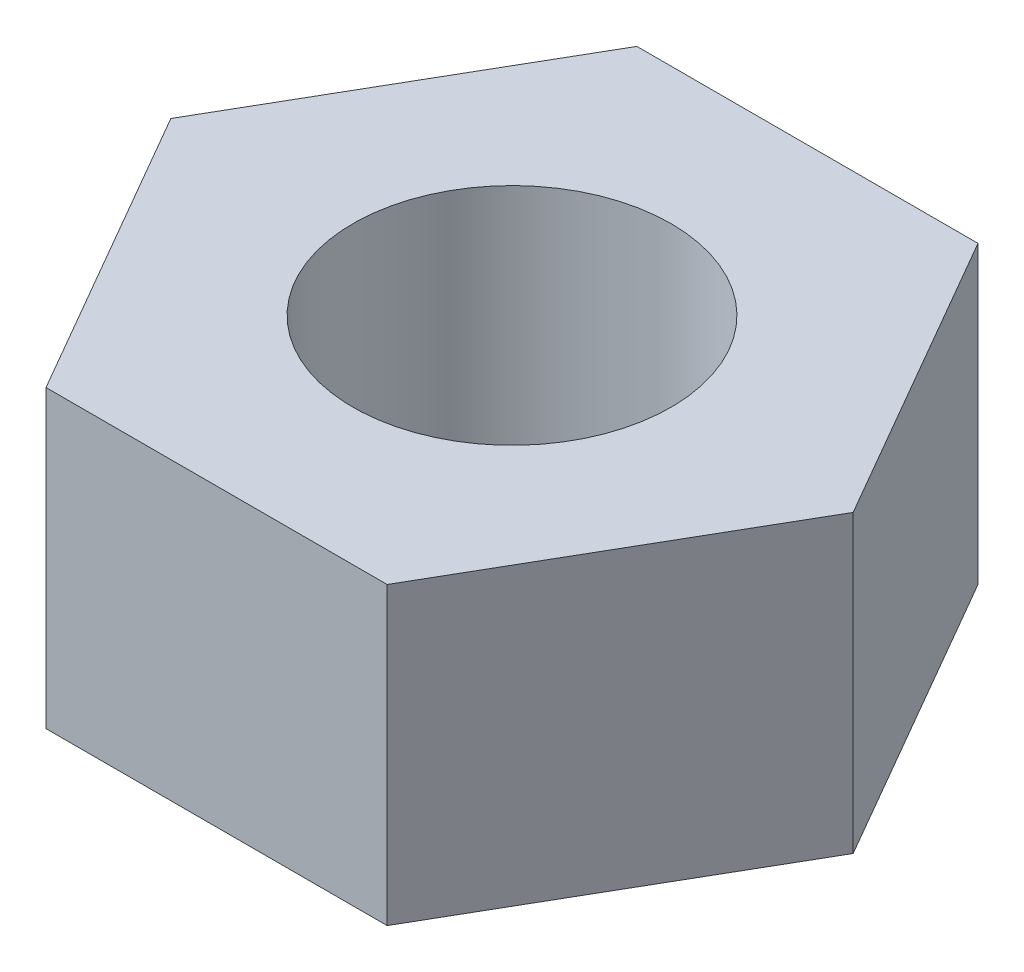
ISO-10303-21;
HEADER;
FILE_DESCRIPTION(('STEP AP214'),'2;1');
FILE_NAME('part.step','',(''),(''),'','','');
FILE_SCHEMA(('AUTOMOTIVE_DESIGN { 1 0 10303 214 1 1 1 1 }'));
ENDSEC;
DATA;
#1=APPLICATION_CONTEXT('core data for automotive mechanical design processes');
#2=APPLICATION_PROTOCOL_DEFINITION('international standard','automotive_design',2000,#1);
#3=PRODUCT_CONTEXT('',#1,'mechanical');
#4=PRODUCT('Part','Part','',(#3));
#5=PRODUCT_RELATED_PRODUCT_CATEGORY('part','',(#4));
#6=PRODUCT_DEFINITION_FORMATION('','',#4);
#7=PRODUCT_DEFINITION_CONTEXT('part definition',#1,'design');
#8=PRODUCT_DEFINITION('design','',#6,#7);
#9=PRODUCT_DEFINITION_SHAPE('','',#8);
#10=(LENGTH_UNIT() NAMED_UNIT(*) SI_UNIT(.MILLI.,.METRE.));
#11=(NAMED_UNIT(*) PLANE_ANGLE_UNIT() SI_UNIT($,.RADIAN.));
#12=(NAMED_UNIT(*) SI_UNIT($,.STERADIAN.) SOLID_ANGLE_UNIT());
#13=UNCERTAINTY_MEASURE_WITH_UNIT(LENGTH_MEASURE(1.E-05),#10,'distance_accuracy_value','');
#14=(GEOMETRIC_REPRESENTATION_CONTEXT(3) GLOBAL_UNCERTAINTY_ASSIGNED_CONTEXT((#13)) GLOBAL_UNIT_ASSIGNED_CONTEXT((#10,
#11,#12)) REPRESENTATION_CONTEXT('',''));
#15=CARTESIAN_POINT('',(0.,0.,0.));
#16=DIRECTION('',(0.,0.,1.));
#17=DIRECTION('',(1.,0.,0.));
#18=AXIS2_PLACEMENT_3D('',#15,#16,#17);
#19=CARTESIAN_POINT('',(0.,6.5,0.));
#20=DIRECTION('',(0.,1.,0.));
#21=DIRECTION('',(0.,0.,1.));
#22=AXIS2_PLACEMENT_3D('',#19,#20,#21);
#23=PLANE('',#22);
#24=DIRECTION('',(-0.5,0.,-0.866025403784439));
#25=VECTOR('',#24,1.);
#26=CARTESIAN_POINT('',(7.50555349946513,6.5,0.));
#27=LINE('',#26,#25);
#28=CARTESIAN_POINT('',(7.50555349946513,6.5,0.));
#29=VERTEX_POINT('',#28);
#30=CARTESIAN_POINT('',(3.75277674973257,6.5,-6.5));
#31=VERTEX_POINT('',#30);
#32=EDGE_CURVE('E131',#29,#31,#27,.T.);
#33=ORIENTED_EDGE('',*,*,#32,.T.);
#34=DIRECTION('',(-1.,0.,0.));
#35=VECTOR('',#34,1.);
#36=CARTESIAN_POINT('',(3.75277674973257,6.5,-6.5));
#37=LINE('',#36,#35);
#38=CARTESIAN_POINT('',(-3.75277674973257,6.5,-6.5));
#39=VERTEX_POINT('',#38);
#40=EDGE_CURVE('E89',#31,#39,#37,.T.);
#41=ORIENTED_EDGE('',*,*,#40,.T.);
#42=DIRECTION('',(-0.5,0.,0.866025403784439));
#43=VECTOR('',#42,1.);
#44=CARTESIAN_POINT('',(-3.75277674973257,6.5,-6.5));
#45=LINE('',#44,#43);
#46=CARTESIAN_POINT('',(-7.50555349946513,6.5,0.));
#47=VERTEX_POINT('',#46);
#48=EDGE_CURVE('E102',#39,#47,#45,.T.);
#49=ORIENTED_EDGE('',*,*,#48,.T.);
#50=DIRECTION('',(0.5,0.,0.866025403784439));
#51=VECTOR('',#50,1.);
#52=CARTESIAN_POINT('',(-7.50555349946513,6.5,0.));
#53=LINE('',#52,#51);
#54=CARTESIAN_POINT('',(-3.75277674973256,6.5,6.5));
#55=VERTEX_POINT('',#54);
#56=EDGE_CURVE('E96',#47,#55,#53,.T.);
#57=ORIENTED_EDGE('',*,*,#56,.T.);
#58=DIRECTION('',(1.,0.,0.));
#59=VECTOR('',#58,1.);
#60=CARTESIAN_POINT('',(-3.75277674973256,6.5,6.5));
#61=LINE('',#60,#59);
#62=CARTESIAN_POINT('',(3.75277674973257,6.5,6.5));
#63=VERTEX_POINT('',#62);
#64=EDGE_CURVE('E100',#55,#63,#61,.T.);
#65=ORIENTED_EDGE('',*,*,#64,.T.);
#66=DIRECTION('',(0.5,0.,-0.866025403784439));
#67=VECTOR('',#66,1.);
#68=CARTESIAN_POINT('',(3.75277674973257,6.5,6.5));
#69=LINE('',#68,#67);
#70=EDGE_CURVE('E52',#63,#29,#69,.T.);
#71=ORIENTED_EDGE('',*,*,#70,.T.);
#72=EDGE_LOOP('',(#33,#41,#49,#57,#65,#71));
#73=FACE_BOUND('',#72,.T.);
#74=CARTESIAN_POINT('',(0.,6.5,0.));
#75=DIRECTION('',(0.,1.,0.));
#76=DIRECTION('',(0.,0.,1.));
#77=AXIS2_PLACEMENT_3D('',#74,#75,#76);
#78=CIRCLE('',#77,3.5);
#79=CARTESIAN_POINT('',(0.,6.5,-3.5));
#80=VERTEX_POINT('',#79);
#81=EDGE_CURVE('E124',#80,#80,#78,.T.);
#82=ORIENTED_EDGE('',*,*,#81,.F.);
#83=EDGE_LOOP('',(#82));
#84=FACE_BOUND('',#83,.T.);
#85=ADVANCED_FACE('F35',(#73,#84),#23,.T.);
#86=CARTESIAN_POINT('',(0.,0.,0.));
#87=DIRECTION('',(0.,1.,0.));
#88=DIRECTION('',(0.,0.,1.));
#89=AXIS2_PLACEMENT_3D('',#86,#87,#88);
#90=PLANE('',#89);
#91=DIRECTION('',(-0.5,0.,-0.866025403784439));
#92=VECTOR('',#91,1.);
#93=CARTESIAN_POINT('',(7.50555349946513,0.,0.));
#94=LINE('',#93,#92);
#95=CARTESIAN_POINT('',(7.50555349946513,0.,0.));
#96=VERTEX_POINT('',#95);
#97=CARTESIAN_POINT('',(3.75277674973257,0.,-6.5));
#98=VERTEX_POINT('',#97);
#99=EDGE_CURVE('E120',#96,#98,#94,.T.);
#100=ORIENTED_EDGE('',*,*,#99,.F.);
#101=DIRECTION('',(0.5,0.,-0.866025403784439));
#102=VECTOR('',#101,1.);
#103=CARTESIAN_POINT('',(3.75277674973257,0.,6.5));
#104=LINE('',#103,#102);
#105=CARTESIAN_POINT('',(3.75277674973257,0.,6.5));
#106=VERTEX_POINT('',#105);
#107=EDGE_CURVE('E81',#106,#96,#104,.T.);
#108=ORIENTED_EDGE('',*,*,#107,.F.);
#109=DIRECTION('',(1.,0.,0.));
#110=VECTOR('',#109,1.);
#111=CARTESIAN_POINT('',(-3.75277674973256,0.,6.5));
#112=LINE('',#111,#110);
#113=CARTESIAN_POINT('',(-3.75277674973256,0.,6.5));
#114=VERTEX_POINT('',#113);
#115=EDGE_CURVE('E75',#114,#106,#112,.T.);
#116=ORIENTED_EDGE('',*,*,#115,.F.);
#117=DIRECTION('',(0.5,0.,0.866025403784439));
#118=VECTOR('',#117,1.);
#119=CARTESIAN_POINT('',(-7.50555349946513,0.,0.));
#120=LINE('',#119,#118);
#121=CARTESIAN_POINT('',(-7.50555349946513,0.,0.));
#122=VERTEX_POINT('',#121);
#123=EDGE_CURVE('E110',#122,#114,#120,.T.);
#124=ORIENTED_EDGE('',*,*,#123,.F.);
#125=DIRECTION('',(-0.5,0.,0.866025403784439));
#126=VECTOR('',#125,1.);
#127=CARTESIAN_POINT('',(-3.75277674973257,0.,-6.5));
#128=LINE('',#127,#126);
#129=CARTESIAN_POINT('',(-3.75277674973257,0.,-6.5));
#130=VERTEX_POINT('',#129);
#131=EDGE_CURVE('E126',#130,#122,#128,.T.);
#132=ORIENTED_EDGE('',*,*,#131,.F.);
#133=DIRECTION('',(-1.,0.,0.));
#134=VECTOR('',#133,1.);
#135=CARTESIAN_POINT('',(3.75277674973257,0.,-6.5));
#136=LINE('',#135,#134);
#137=EDGE_CURVE('E123',#98,#130,#136,.T.);
#138=ORIENTED_EDGE('',*,*,#137,.F.);
#139=EDGE_LOOP('',(#100,#108,#116,#124,#132,#138));
#140=FACE_BOUND('',#139,.T.);
#141=CARTESIAN_POINT('',(0.,0.,0.));
#142=DIRECTION('',(0.,1.,0.));
#143=DIRECTION('',(0.,0.,1.));
#144=AXIS2_PLACEMENT_3D('',#141,#142,#143);
#145=CIRCLE('',#144,3.5);
#146=CARTESIAN_POINT('',(0.,0.,-3.5));
#147=VERTEX_POINT('',#146);
#148=EDGE_CURVE('E224',#147,#147,#145,.T.);
#149=ORIENTED_EDGE('',*,*,#148,.T.);
#150=EDGE_LOOP('',(#149));
#151=FACE_BOUND('',#150,.T.);
#152=ADVANCED_FACE('F140',(#140,#151),#90,.F.);
#153=CARTESIAN_POINT('',(7.50555349946513,6.5,0.));
#154=DIRECTION('',(-0.866025403784438,0.,0.5));
#155=DIRECTION('',(0.5,0.,0.866025403784439));
#156=AXIS2_PLACEMENT_3D('',#153,#154,#155);
#157=PLANE('',#156);
#158=ORIENTED_EDGE('',*,*,#99,.T.);
#159=DIRECTION('',(0.,-1.,0.));
#160=VECTOR('',#159,1.);
#161=CARTESIAN_POINT('',(3.75277674973257,6.5,-6.5));
#162=LINE('',#161,#160);
#163=EDGE_CURVE('E11',#31,#98,#162,.T.);
#164=ORIENTED_EDGE('',*,*,#163,.F.);
#165=ORIENTED_EDGE('',*,*,#32,.F.);
#166=DIRECTION('',(0.,-1.,0.));
#167=VECTOR('',#166,1.);
#168=CARTESIAN_POINT('',(7.50555349946513,6.5,0.));
#169=LINE('',#168,#167);
#170=EDGE_CURVE('E116',#29,#96,#169,.T.);
#171=ORIENTED_EDGE('',*,*,#170,.T.);
#172=EDGE_LOOP('',(#158,#164,#165,#171));
#173=FACE_BOUND('',#172,.T.);
#174=ADVANCED_FACE('F37',(#173),#157,.F.);
#175=CARTESIAN_POINT('',(3.75277674973257,6.5,-6.5));
#176=DIRECTION('',(0.,0.,1.));
#177=DIRECTION('',(1.,0.,0.));
#178=AXIS2_PLACEMENT_3D('',#175,#176,#177);
#179=PLANE('',#178);
#180=ORIENTED_EDGE('',*,*,#137,.T.);
#181=DIRECTION('',(0.,-1.,0.));
#182=VECTOR('',#181,1.);
#183=CARTESIAN_POINT('',(-3.75277674973257,6.5,-6.5));
#184=LINE('',#183,#182);
#185=EDGE_CURVE('E44',#39,#130,#184,.T.);
#186=ORIENTED_EDGE('',*,*,#185,.F.);
#187=ORIENTED_EDGE('',*,*,#40,.F.);
#188=ORIENTED_EDGE('',*,*,#163,.T.);
#189=EDGE_LOOP('',(#180,#186,#187,#188));
#190=FACE_BOUND('',#189,.T.);
#191=ADVANCED_FACE('F165',(#190),#179,.F.);
#192=CARTESIAN_POINT('',(-3.75277674973257,6.5,-6.5));
#193=DIRECTION('',(0.866025403784439,0.,0.5));
#194=DIRECTION('',(0.5,0.,-0.866025403784439));
#195=AXIS2_PLACEMENT_3D('',#192,#193,#194);
#196=PLANE('',#195);
#197=ORIENTED_EDGE('',*,*,#131,.T.);
#198=DIRECTION('',(0.,-1.,0.));
#199=VECTOR('',#198,1.);
#200=CARTESIAN_POINT('',(-7.50555349946513,6.5,0.));
#201=LINE('',#200,#199);
#202=EDGE_CURVE('E111',#47,#122,#201,.T.);
#203=ORIENTED_EDGE('',*,*,#202,.F.);
#204=ORIENTED_EDGE('',*,*,#48,.F.);
#205=ORIENTED_EDGE('',*,*,#185,.T.);
#206=EDGE_LOOP('',(#197,#203,#204,#205));
#207=FACE_BOUND('',#206,.T.);
#208=ADVANCED_FACE('F137',(#207),#196,.F.);
#209=CARTESIAN_POINT('',(-7.50555349946513,6.5,0.));
#210=DIRECTION('',(0.866025403784438,0.,-0.5));
#211=DIRECTION('',(-0.5,0.,-0.866025403784438));
#212=AXIS2_PLACEMENT_3D('',#209,#210,#211);
#213=PLANE('',#212);
#214=ORIENTED_EDGE('',*,*,#123,.T.);
#215=DIRECTION('',(0.,-1.,0.));
#216=VECTOR('',#215,1.);
#217=CARTESIAN_POINT('',(-3.75277674973256,6.5,6.5));
#218=LINE('',#217,#216);
#219=EDGE_CURVE('E107',#55,#114,#218,.T.);
#220=ORIENTED_EDGE('',*,*,#219,.F.);
#221=ORIENTED_EDGE('',*,*,#56,.F.);
#222=ORIENTED_EDGE('',*,*,#202,.T.);
#223=EDGE_LOOP('',(#214,#220,#221,#222));
#224=FACE_BOUND('',#223,.T.);
#225=ADVANCED_FACE('F108',(#224),#213,.F.);
#226=CARTESIAN_POINT('',(-3.75277674973256,6.5,6.5));
#227=DIRECTION('',(0.,0.,-1.));
#228=DIRECTION('',(-1.,0.,0.));
#229=AXIS2_PLACEMENT_3D('',#226,#227,#228);
#230=PLANE('',#229);
#231=ORIENTED_EDGE('',*,*,#115,.T.);
#232=DIRECTION('',(0.,-1.,0.));
#233=VECTOR('',#232,1.);
#234=CARTESIAN_POINT('',(3.75277674973257,6.5,6.5));
#235=LINE('',#234,#233);
#236=EDGE_CURVE('E112',#63,#106,#235,.T.);
#237=ORIENTED_EDGE('',*,*,#236,.F.);
#238=ORIENTED_EDGE('',*,*,#64,.F.);
#239=ORIENTED_EDGE('',*,*,#219,.T.);
#240=EDGE_LOOP('',(#231,#237,#238,#239));
#241=FACE_BOUND('',#240,.T.);
#242=ADVANCED_FACE('F114',(#241),#230,.F.);
#243=CARTESIAN_POINT('',(3.75277674973257,6.5,6.5));
#244=DIRECTION('',(-0.866025403784439,0.,-0.5));
#245=DIRECTION('',(-0.5,0.,0.866025403784439));
#246=AXIS2_PLACEMENT_3D('',#243,#244,#245);
#247=PLANE('',#246);
#248=ORIENTED_EDGE('',*,*,#107,.T.);
#249=ORIENTED_EDGE('',*,*,#170,.F.);
#250=ORIENTED_EDGE('',*,*,#70,.F.);
#251=ORIENTED_EDGE('',*,*,#236,.T.);
#252=EDGE_LOOP('',(#248,#249,#250,#251));
#253=FACE_BOUND('',#252,.T.);
#254=ADVANCED_FACE('F145',(#253),#247,.F.);
#255=CARTESIAN_POINT('',(0.,6.5,0.));
#256=DIRECTION('',(0.,-1.,0.));
#257=DIRECTION('',(0.,0.,-1.));
#258=AXIS2_PLACEMENT_3D('',#255,#256,#257);
#259=CYLINDRICAL_SURFACE('',#258,3.5);
#260=CARTESIAN_POINT('',(0.,6.5,-3.5));
#261=CARTESIAN_POINT('',(0.,6.43229166666667,-3.5));
#262=CARTESIAN_POINT('',(0.,6.36458333333333,-3.5));
#263=CARTESIAN_POINT('',(0.,6.22916666666667,-3.5));
#264=CARTESIAN_POINT('',(0.,6.16145833333333,-3.5));
#265=CARTESIAN_POINT('',(0.,6.02604166666667,-3.5));
#266=CARTESIAN_POINT('',(0.,5.95833333333333,-3.5));
#267=CARTESIAN_POINT('',(0.,5.82291666666667,-3.5));
#268=CARTESIAN_POINT('',(0.,5.75520833333333,-3.5));
#269=CARTESIAN_POINT('',(0.,5.61979166666667,-3.5));
#270=CARTESIAN_POINT('',(0.,5.55208333333333,-3.5));
#271=CARTESIAN_POINT('',(0.,5.41666666666667,-3.5));
#272=CARTESIAN_POINT('',(0.,5.34895833333333,-3.5));
#273=CARTESIAN_POINT('',(0.,5.21354166666667,-3.5));
#274=CARTESIAN_POINT('',(0.,5.14583333333333,-3.5));
#275=CARTESIAN_POINT('',(0.,5.01041666666667,-3.5));
#276=CARTESIAN_POINT('',(0.,4.94270833333333,-3.5));
#277=CARTESIAN_POINT('',(0.,4.80729166666667,-3.5));
#278=CARTESIAN_POINT('',(0.,4.73958333333333,-3.5));
#279=CARTESIAN_POINT('',(0.,4.60416666666667,-3.5));
#280=CARTESIAN_POINT('',(0.,4.53645833333333,-3.5));
#281=CARTESIAN_POINT('',(0.,4.40104166666667,-3.5));
#282=CARTESIAN_POINT('',(0.,4.33333333333333,-3.5));
#283=CARTESIAN_POINT('',(0.,4.19791666666667,-3.5));
#284=CARTESIAN_POINT('',(0.,4.13020833333333,-3.5));
#285=CARTESIAN_POINT('',(0.,3.99479166666667,-3.5));
#286=CARTESIAN_POINT('',(0.,3.92708333333333,-3.5));
#287=CARTESIAN_POINT('',(0.,3.79166666666667,-3.5));
#288=CARTESIAN_POINT('',(0.,3.72395833333333,-3.5));
#289=CARTESIAN_POINT('',(0.,3.58854166666667,-3.5));
#290=CARTESIAN_POINT('',(0.,3.52083333333333,-3.5));
#291=CARTESIAN_POINT('',(0.,3.38541666666667,-3.5));
#292=CARTESIAN_POINT('',(0.,3.31770833333333,-3.5));
#293=CARTESIAN_POINT('',(0.,3.18229166666667,-3.5));
#294=CARTESIAN_POINT('',(0.,3.11458333333333,-3.5));
#295=CARTESIAN_POINT('',(0.,2.97916666666667,-3.5));
#296=CARTESIAN_POINT('',(0.,2.91145833333333,-3.5));
#297=CARTESIAN_POINT('',(0.,2.77604166666667,-3.5));
#298=CARTESIAN_POINT('',(0.,2.70833333333333,-3.5));
#299=CARTESIAN_POINT('',(0.,2.57291666666667,-3.5));
#300=CARTESIAN_POINT('',(0.,2.50520833333333,-3.5));
#301=CARTESIAN_POINT('',(0.,2.36979166666667,-3.5));
#302=CARTESIAN_POINT('',(0.,2.30208333333333,-3.5));
#303=CARTESIAN_POINT('',(0.,2.16666666666667,-3.5));
#304=CARTESIAN_POINT('',(0.,2.09895833333333,-3.5));
#305=CARTESIAN_POINT('',(0.,1.96354166666667,-3.5));
#306=CARTESIAN_POINT('',(0.,1.89583333333333,-3.5));
#307=CARTESIAN_POINT('',(0.,1.76041666666667,-3.5));
#308=CARTESIAN_POINT('',(0.,1.69270833333333,-3.5));
#309=CARTESIAN_POINT('',(0.,1.55729166666667,-3.5));
#310=CARTESIAN_POINT('',(0.,1.48958333333333,-3.5));
#311=CARTESIAN_POINT('',(0.,1.35416666666667,-3.5));
#312=CARTESIAN_POINT('',(0.,1.28645833333333,-3.5));
#313=CARTESIAN_POINT('',(0.,1.15104166666667,-3.5));
#314=CARTESIAN_POINT('',(0.,1.08333333333333,-3.5));
#315=CARTESIAN_POINT('',(0.,0.947916666666667,-3.5));
#316=CARTESIAN_POINT('',(0.,0.880208333333333,-3.5));
#317=CARTESIAN_POINT('',(0.,0.744791666666667,-3.5));
#318=CARTESIAN_POINT('',(0.,0.677083333333333,-3.5));
#319=CARTESIAN_POINT('',(0.,0.541666666666667,-3.5));
#320=CARTESIAN_POINT('',(0.,0.473958333333333,-3.5));
#321=CARTESIAN_POINT('',(0.,0.338541666666667,-3.5));
#322=CARTESIAN_POINT('',(0.,0.270833333333334,-3.5));
#323=CARTESIAN_POINT('',(0.,0.135416666666667,-3.5));
#324=CARTESIAN_POINT('',(0.,0.0677083333333334,-3.5));
#325=CARTESIAN_POINT('',(0.,0.,-3.5));
#326=B_SPLINE_CURVE_WITH_KNOTS('',3,(#260,#261,#262,#263,#264,#265,#266,#267,#268,#269,#270,
#271,#272,#273,#274,#275,#276,#277,#278,#279,#280,#281,#282,#283,#284,#285,#286,#287,#288,#289,
#290,#291,#292,#293,#294,#295,#296,#297,#298,#299,#300,#301,#302,#303,#304,#305,#306,#307,#308,
#309,#310,#311,#312,#313,#314,#315,#316,#317,#318,#319,#320,#321,#322,#323,#324,#325),
.UNSPECIFIED.,.F.,.F.,(4,2,2,2,2,2,2,2,2,2,2,2,2,2,2,2,2,2,2,2,2,2,2,2,2,2,2,2,2,2,2,2,4),(0.,
0.203124999999999,0.40625,0.609375,0.812499999999999,1.015625,1.21875,1.421875,1.625,1.828125,
2.03125,2.234375,2.4375,2.640625,2.84375,3.046875,3.25,3.453125,3.65625,3.859375,4.0625,
4.265625,4.46875,4.671875,4.875,5.078125,5.28125,5.484375,5.6875,5.890625,6.09375,6.296875,6.5),.UNSPECIFIED.);
#327=EDGE_CURVE('BSEAM147',#80,#147,#326,.T.);
#328=ORIENTED_EDGE('',*,*,#81,.T.);
#329=ORIENTED_EDGE('',*,*,#148,.F.);
#330=ORIENTED_EDGE('',*,*,#327,.T.);
#331=ORIENTED_EDGE('',*,*,#327,.F.);
#332=EDGE_LOOP('',(#328,#330,#329,#331));
#333=FACE_BOUND('',#332,.T.);
#334=ADVANCED_FACE('F147',(#333),#259,.F.);
#335=CLOSED_SHELL('',(#85,#152,#174,#191,#208,#225,#242,#254,#334));
#336=MANIFOLD_SOLID_BREP('B2',#335);
#337=ADVANCED_BREP_SHAPE_REPRESENTATION('',(#18,#336),#14);
#338=SHAPE_DEFINITION_REPRESENTATION(#9,#337);
ENDSEC;
END-ISO-10303-21;
